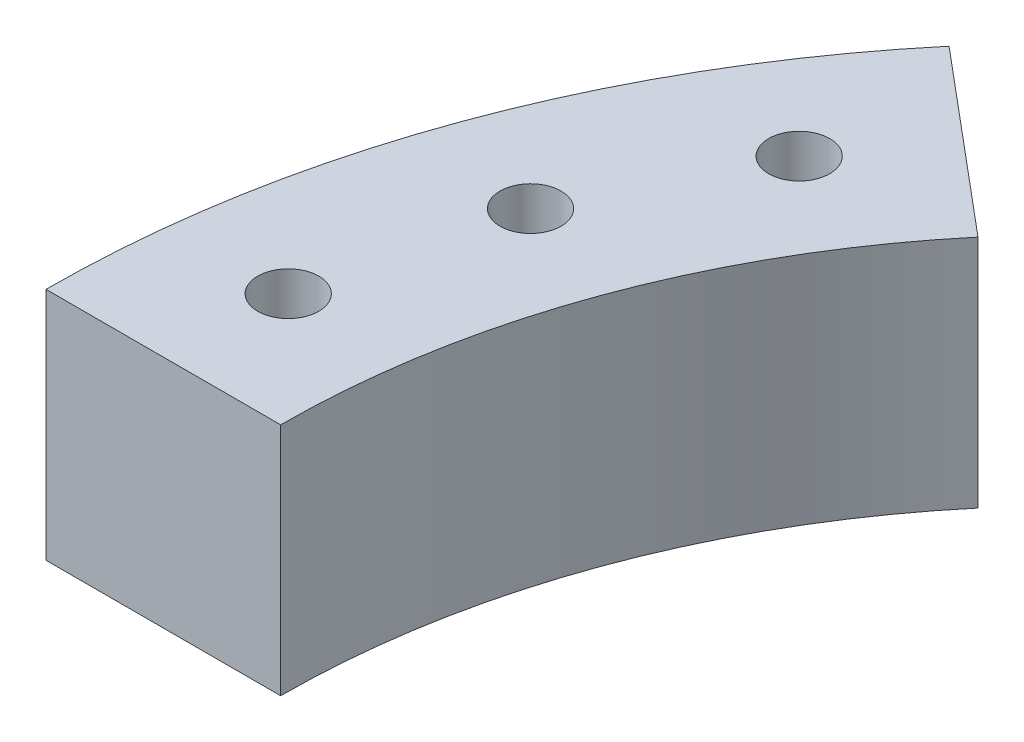
ISO-10303-21;
HEADER;
FILE_DESCRIPTION(('STEP AP214'),'2;1');
FILE_NAME('part.step','',(''),(''),'','','');
FILE_SCHEMA(('AUTOMOTIVE_DESIGN { 1 0 10303 214 1 1 1 1 }'));
ENDSEC;
DATA;
#1=APPLICATION_CONTEXT('core data for automotive mechanical design processes');
#2=APPLICATION_PROTOCOL_DEFINITION('international standard','automotive_design',2000,#1);
#3=PRODUCT_CONTEXT('',#1,'mechanical');
#4=PRODUCT('Part','Part','',(#3));
#5=PRODUCT_RELATED_PRODUCT_CATEGORY('part','',(#4));
#6=PRODUCT_DEFINITION_FORMATION('','',#4);
#7=PRODUCT_DEFINITION_CONTEXT('part definition',#1,'design');
#8=PRODUCT_DEFINITION('design','',#6,#7);
#9=PRODUCT_DEFINITION_SHAPE('','',#8);
#10=(LENGTH_UNIT() NAMED_UNIT(*) SI_UNIT(.MILLI.,.METRE.));
#11=(NAMED_UNIT(*) PLANE_ANGLE_UNIT() SI_UNIT($,.RADIAN.));
#12=(NAMED_UNIT(*) SI_UNIT($,.STERADIAN.) SOLID_ANGLE_UNIT());
#13=UNCERTAINTY_MEASURE_WITH_UNIT(LENGTH_MEASURE(1.E-05),#10,'distance_accuracy_value','');
#14=(GEOMETRIC_REPRESENTATION_CONTEXT(3) GLOBAL_UNCERTAINTY_ASSIGNED_CONTEXT((#13)) GLOBAL_UNIT_ASSIGNED_CONTEXT((#10,
#11,#12)) REPRESENTATION_CONTEXT('',''));
#15=CARTESIAN_POINT('',(0.,0.,0.));
#16=DIRECTION('',(0.,0.,1.));
#17=DIRECTION('',(1.,0.,0.));
#18=AXIS2_PLACEMENT_3D('',#15,#16,#17);
#19=CARTESIAN_POINT('',(77.7861913430201,20.,0.));
#20=DIRECTION('',(0.,-1.,0.));
#21=DIRECTION('',(0.,0.,-1.));
#22=AXIS2_PLACEMENT_3D('',#19,#20,#21);
#23=PLANE('',#22);
#24=CARTESIAN_POINT('',(77.7861913430201,20.,0.));
#25=DIRECTION('',(0.,-1.,0.));
#26=DIRECTION('',(0.,0.,-1.));
#27=AXIS2_PLACEMENT_3D('',#24,#25,#26);
#28=CIRCLE('',#27,67.7861913430201);
#29=CARTESIAN_POINT('',(9.99999999999999,20.,0.));
#30=VERTEX_POINT('',#29);
#31=CARTESIAN_POINT('',(25.8589561445,20.,-43.5721239031346));
#32=VERTEX_POINT('',#31);
#33=EDGE_CURVE('E84',#30,#32,#28,.T.);
#34=ORIENTED_EDGE('',*,*,#33,.T.);
#35=DIRECTION('',(-0.766044443118974,0.,-0.642787609686544));
#36=VECTOR('',#35,1.);
#37=CARTESIAN_POINT('',(25.8589561445,20.,-43.5721239031346));
#38=LINE('',#37,#36);
#39=CARTESIAN_POINT('',(10.5380672821205,20.,-56.4278760968654));
#40=VERTEX_POINT('',#39);
#41=EDGE_CURVE('E79',#32,#40,#38,.T.);
#42=ORIENTED_EDGE('',*,*,#41,.T.);
#43=CARTESIAN_POINT('',(77.7861913430201,20.,0.));
#44=DIRECTION('',(0.,1.,0.));
#45=DIRECTION('',(0.,0.,-1.));
#46=AXIS2_PLACEMENT_3D('',#43,#44,#45);
#47=CIRCLE('',#46,87.7861913430201);
#48=CARTESIAN_POINT('',(-9.99999999999999,20.,0.));
#49=VERTEX_POINT('',#48);
#50=EDGE_CURVE('E82',#40,#49,#47,.T.);
#51=ORIENTED_EDGE('',*,*,#50,.T.);
#52=DIRECTION('',(1.,0.,0.));
#53=VECTOR('',#52,1.);
#54=CARTESIAN_POINT('',(9.99999999999999,20.,0.));
#55=LINE('',#54,#53);
#56=EDGE_CURVE('E49',#49,#30,#55,.T.);
#57=ORIENTED_EDGE('',*,*,#56,.T.);
#58=EDGE_LOOP('',(#34,#42,#51,#57));
#59=FACE_BOUND('',#58,.T.);
#60=CARTESIAN_POINT('',(4.69108133894348,20.,-26.6044443118978));
#61=DIRECTION('',(0.,1.,0.));
#62=DIRECTION('',(0.,0.,1.));
#63=AXIS2_PLACEMENT_3D('',#60,#61,#62);
#64=CIRCLE('',#63,2.60000000000009);
#65=CARTESIAN_POINT('',(4.69108133894348,20.,-24.0044443118977));
#66=VERTEX_POINT('',#65);
#67=EDGE_CURVE('E99',#66,#66,#64,.T.);
#68=ORIENTED_EDGE('',*,*,#67,.F.);
#69=EDGE_LOOP('',(#68));
#70=FACE_BOUND('',#69,.T.);
#71=CARTESIAN_POINT('',(0.645465629212249,20.,-10.));
#72=DIRECTION('',(0.,1.,0.));
#73=DIRECTION('',(0.,0.,1.));
#74=AXIS2_PLACEMENT_3D('',#71,#72,#73);
#75=CIRCLE('',#74,2.6);
#76=CARTESIAN_POINT('',(0.645465629212249,20.,-7.4));
#77=VERTEX_POINT('',#76);
#78=EDGE_CURVE('E114',#77,#77,#75,.T.);
#79=ORIENTED_EDGE('',*,*,#78,.F.);
#80=EDGE_LOOP('',(#79));
#81=FACE_BOUND('',#80,.T.);
#82=CARTESIAN_POINT('',(12.2650909749272,20.,-41.9246582598741));
#83=DIRECTION('',(0.,1.,0.));
#84=DIRECTION('',(0.,0.,1.));
#85=AXIS2_PLACEMENT_3D('',#82,#83,#84);
#86=CIRCLE('',#85,2.60000000000034);
#87=CARTESIAN_POINT('',(12.2650909749272,20.,-39.3246582598737));
#88=VERTEX_POINT('',#87);
#89=EDGE_CURVE('E120',#88,#88,#86,.T.);
#90=ORIENTED_EDGE('',*,*,#89,.F.);
#91=EDGE_LOOP('',(#90));
#92=FACE_BOUND('',#91,.T.);
#93=ADVANCED_FACE('F32',(#59,#70,#81,#92),#23,.F.);
#94=CARTESIAN_POINT('',(77.7861913430201,0.,0.));
#95=DIRECTION('',(0.,-1.,0.));
#96=DIRECTION('',(0.,0.,-1.));
#97=AXIS2_PLACEMENT_3D('',#94,#95,#96);
#98=PLANE('',#97);
#99=CARTESIAN_POINT('',(0.645465629212249,0.,-10.));
#100=DIRECTION('',(0.,1.,0.));
#101=DIRECTION('',(0.,0.,1.));
#102=AXIS2_PLACEMENT_3D('',#99,#100,#101);
#103=CIRCLE('',#102,2.6);
#104=CARTESIAN_POINT('',(0.645465629212249,0.,-7.4));
#105=VERTEX_POINT('',#104);
#106=EDGE_CURVE('E117',#105,#105,#103,.T.);
#107=ORIENTED_EDGE('',*,*,#106,.T.);
#108=EDGE_LOOP('',(#107));
#109=FACE_BOUND('',#108,.T.);
#110=CARTESIAN_POINT('',(77.7861913430201,0.,0.));
#111=DIRECTION('',(0.,-1.,0.));
#112=DIRECTION('',(0.,0.,-1.));
#113=AXIS2_PLACEMENT_3D('',#110,#111,#112);
#114=CIRCLE('',#113,67.7861913430201);
#115=CARTESIAN_POINT('',(9.99999999999999,0.,0.));
#116=VERTEX_POINT('',#115);
#117=CARTESIAN_POINT('',(25.8589561445,0.,-43.5721239031346));
#118=VERTEX_POINT('',#117);
#119=EDGE_CURVE('E96',#116,#118,#114,.T.);
#120=ORIENTED_EDGE('',*,*,#119,.F.);
#121=DIRECTION('',(1.,0.,0.));
#122=VECTOR('',#121,1.);
#123=CARTESIAN_POINT('',(9.99999999999999,0.,0.));
#124=LINE('',#123,#122);
#125=CARTESIAN_POINT('',(-9.99999999999999,0.,0.));
#126=VERTEX_POINT('',#125);
#127=EDGE_CURVE('E72',#126,#116,#124,.T.);
#128=ORIENTED_EDGE('',*,*,#127,.F.);
#129=CARTESIAN_POINT('',(77.7861913430201,0.,0.));
#130=DIRECTION('',(0.,1.,0.));
#131=DIRECTION('',(0.,0.,-1.));
#132=AXIS2_PLACEMENT_3D('',#129,#130,#131);
#133=CIRCLE('',#132,87.7861913430201);
#134=CARTESIAN_POINT('',(10.5380672821205,0.,-56.4278760968654));
#135=VERTEX_POINT('',#134);
#136=EDGE_CURVE('E66',#135,#126,#133,.T.);
#137=ORIENTED_EDGE('',*,*,#136,.F.);
#138=DIRECTION('',(-0.766044443118974,0.,-0.642787609686544));
#139=VECTOR('',#138,1.);
#140=CARTESIAN_POINT('',(25.8589561445,0.,-43.5721239031346));
#141=LINE('',#140,#139);
#142=EDGE_CURVE('E88',#118,#135,#141,.T.);
#143=ORIENTED_EDGE('',*,*,#142,.F.);
#144=EDGE_LOOP('',(#120,#128,#137,#143));
#145=FACE_BOUND('',#144,.T.);
#146=CARTESIAN_POINT('',(4.69108133894348,0.,-26.6044443118978));
#147=DIRECTION('',(0.,1.,0.));
#148=DIRECTION('',(0.,0.,1.));
#149=AXIS2_PLACEMENT_3D('',#146,#147,#148);
#150=CIRCLE('',#149,2.60000000000009);
#151=CARTESIAN_POINT('',(4.69108133894348,0.,-24.0044443118977));
#152=VERTEX_POINT('',#151);
#153=EDGE_CURVE('E111',#152,#152,#150,.T.);
#154=ORIENTED_EDGE('',*,*,#153,.T.);
#155=EDGE_LOOP('',(#154));
#156=FACE_BOUND('',#155,.T.);
#157=CARTESIAN_POINT('',(12.2650909749272,0.,-41.9246582598741));
#158=DIRECTION('',(0.,1.,0.));
#159=DIRECTION('',(0.,0.,1.));
#160=AXIS2_PLACEMENT_3D('',#157,#158,#159);
#161=CIRCLE('',#160,2.60000000000034);
#162=CARTESIAN_POINT('',(12.2650909749272,0.,-39.3246582598737));
#163=VERTEX_POINT('',#162);
#164=EDGE_CURVE('E123',#163,#163,#161,.T.);
#165=ORIENTED_EDGE('',*,*,#164,.T.);
#166=EDGE_LOOP('',(#165));
#167=FACE_BOUND('',#166,.T.);
#168=ADVANCED_FACE('F107',(#109,#145,#156,#167),#98,.T.);
#169=CARTESIAN_POINT('',(77.7861913430201,20.,0.));
#170=DIRECTION('',(0.,-1.,0.));
#171=DIRECTION('',(0.,0.,-1.));
#172=AXIS2_PLACEMENT_3D('',#169,#170,#171);
#173=CYLINDRICAL_SURFACE('',#172,67.7861913430201);
#174=ORIENTED_EDGE('',*,*,#119,.T.);
#175=DIRECTION('',(0.,-1.,0.));
#176=VECTOR('',#175,1.);
#177=CARTESIAN_POINT('',(25.8589561445,20.,-43.5721239031346));
#178=LINE('',#177,#176);
#179=EDGE_CURVE('E11',#32,#118,#178,.T.);
#180=ORIENTED_EDGE('',*,*,#179,.F.);
#181=ORIENTED_EDGE('',*,*,#33,.F.);
#182=DIRECTION('',(0.,-1.,0.));
#183=VECTOR('',#182,1.);
#184=CARTESIAN_POINT('',(9.99999999999999,20.,0.));
#185=LINE('',#184,#183);
#186=EDGE_CURVE('E92',#30,#116,#185,.T.);
#187=ORIENTED_EDGE('',*,*,#186,.T.);
#188=EDGE_LOOP('',(#174,#180,#181,#187));
#189=FACE_BOUND('',#188,.T.);
#190=ADVANCED_FACE('F34',(#189),#173,.F.);
#191=CARTESIAN_POINT('',(25.8589561445,20.,-43.5721239031346));
#192=DIRECTION('',(-0.642787609686544,0.,0.766044443118974));
#193=DIRECTION('',(0.766044443118974,0.,0.642787609686544));
#194=AXIS2_PLACEMENT_3D('',#191,#192,#193);
#195=PLANE('',#194);
#196=ORIENTED_EDGE('',*,*,#142,.T.);
#197=DIRECTION('',(0.,-1.,0.));
#198=VECTOR('',#197,1.);
#199=CARTESIAN_POINT('',(10.5380672821205,20.,-56.4278760968654));
#200=LINE('',#199,#198);
#201=EDGE_CURVE('E41',#40,#135,#200,.T.);
#202=ORIENTED_EDGE('',*,*,#201,.F.);
#203=ORIENTED_EDGE('',*,*,#41,.F.);
#204=ORIENTED_EDGE('',*,*,#179,.T.);
#205=EDGE_LOOP('',(#196,#202,#203,#204));
#206=FACE_BOUND('',#205,.T.);
#207=ADVANCED_FACE('F87',(#206),#195,.F.);
#208=CARTESIAN_POINT('',(77.7861913430201,20.,0.));
#209=DIRECTION('',(0.,-1.,0.));
#210=DIRECTION('',(0.,0.,-1.));
#211=AXIS2_PLACEMENT_3D('',#208,#209,#210);
#212=CYLINDRICAL_SURFACE('',#211,87.7861913430201);
#213=ORIENTED_EDGE('',*,*,#136,.T.);
#214=DIRECTION('',(0.,-1.,0.));
#215=VECTOR('',#214,1.);
#216=CARTESIAN_POINT('',(-9.99999999999999,20.,0.));
#217=LINE('',#216,#215);
#218=EDGE_CURVE('E89',#49,#126,#217,.T.);
#219=ORIENTED_EDGE('',*,*,#218,.F.);
#220=ORIENTED_EDGE('',*,*,#50,.F.);
#221=ORIENTED_EDGE('',*,*,#201,.T.);
#222=EDGE_LOOP('',(#213,#219,#220,#221));
#223=FACE_BOUND('',#222,.T.);
#224=ADVANCED_FACE('F90',(#223),#212,.T.);
#225=CARTESIAN_POINT('',(9.99999999999999,20.,0.));
#226=DIRECTION('',(0.,0.,-1.));
#227=DIRECTION('',(-1.,0.,0.));
#228=AXIS2_PLACEMENT_3D('',#225,#226,#227);
#229=PLANE('',#228);
#230=ORIENTED_EDGE('',*,*,#127,.T.);
#231=ORIENTED_EDGE('',*,*,#186,.F.);
#232=ORIENTED_EDGE('',*,*,#56,.F.);
#233=ORIENTED_EDGE('',*,*,#218,.T.);
#234=EDGE_LOOP('',(#230,#231,#232,#233));
#235=FACE_BOUND('',#234,.T.);
#236=ADVANCED_FACE('F104',(#235),#229,.F.);
#237=CARTESIAN_POINT('',(4.69108133894348,20.,-26.6044443118978));
#238=DIRECTION('',(0.,-1.,0.));
#239=DIRECTION('',(0.,0.,-1.));
#240=AXIS2_PLACEMENT_3D('',#237,#238,#239);
#241=CYLINDRICAL_SURFACE('',#240,2.60000000000009);
#242=ORIENTED_EDGE('',*,*,#67,.T.);
#243=EDGE_LOOP('',(#242));
#244=FACE_BOUND('',#243,.T.);
#245=ORIENTED_EDGE('',*,*,#153,.F.);
#246=EDGE_LOOP('',(#245));
#247=FACE_BOUND('',#246,.T.);
#248=ADVANCED_FACE('F140',(#244,#247),#241,.F.);
#249=CARTESIAN_POINT('',(0.645465629212249,20.,-10.));
#250=DIRECTION('',(0.,-1.,0.));
#251=DIRECTION('',(0.,0.,-1.));
#252=AXIS2_PLACEMENT_3D('',#249,#250,#251);
#253=CYLINDRICAL_SURFACE('',#252,2.6);
#254=ORIENTED_EDGE('',*,*,#78,.T.);
#255=EDGE_LOOP('',(#254));
#256=FACE_BOUND('',#255,.T.);
#257=ORIENTED_EDGE('',*,*,#106,.F.);
#258=EDGE_LOOP('',(#257));
#259=FACE_BOUND('',#258,.T.);
#260=ADVANCED_FACE('F186',(#256,#259),#253,.F.);
#261=CARTESIAN_POINT('',(12.2650909749272,20.,-41.9246582598741));
#262=DIRECTION('',(0.,-1.,0.));
#263=DIRECTION('',(0.,0.,-1.));
#264=AXIS2_PLACEMENT_3D('',#261,#262,#263);
#265=CYLINDRICAL_SURFACE('',#264,2.60000000000034);
#266=ORIENTED_EDGE('',*,*,#89,.T.);
#267=EDGE_LOOP('',(#266));
#268=FACE_BOUND('',#267,.T.);
#269=ORIENTED_EDGE('',*,*,#164,.F.);
#270=EDGE_LOOP('',(#269));
#271=FACE_BOUND('',#270,.T.);
#272=ADVANCED_FACE('F129',(#268,#271),#265,.F.);
#273=CLOSED_SHELL('',(#93,#168,#190,#207,#224,#236,#248,#260,#272));
#274=MANIFOLD_SOLID_BREP('B2',#273);
#275=ADVANCED_BREP_SHAPE_REPRESENTATION('',(#18,#274),#14);
#276=SHAPE_DEFINITION_REPRESENTATION(#9,#275);
ENDSEC;
END-ISO-10303-21;
